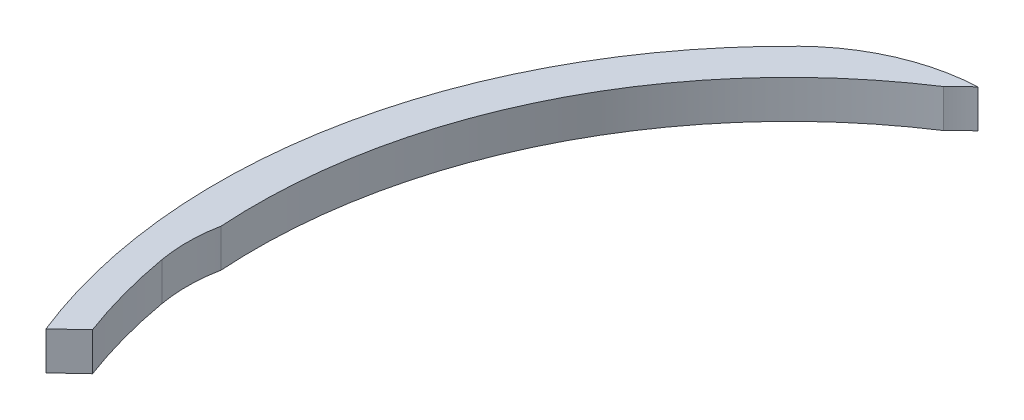
ISO-10303-21;
HEADER;
FILE_DESCRIPTION(('STEP AP214'),'2;1');
FILE_NAME('part.step','',(''),(''),'','','');
FILE_SCHEMA(('AUTOMOTIVE_DESIGN { 1 0 10303 214 1 1 1 1 }'));
ENDSEC;
DATA;
#1=APPLICATION_CONTEXT('core data for automotive mechanical design processes');
#2=APPLICATION_PROTOCOL_DEFINITION('international standard','automotive_design',2000,#1);
#3=PRODUCT_CONTEXT('',#1,'mechanical');
#4=PRODUCT('Part','Part','',(#3));
#5=PRODUCT_RELATED_PRODUCT_CATEGORY('part','',(#4));
#6=PRODUCT_DEFINITION_FORMATION('','',#4);
#7=PRODUCT_DEFINITION_CONTEXT('part definition',#1,'design');
#8=PRODUCT_DEFINITION('design','',#6,#7);
#9=PRODUCT_DEFINITION_SHAPE('','',#8);
#10=(LENGTH_UNIT() NAMED_UNIT(*) SI_UNIT(.MILLI.,.METRE.));
#11=(NAMED_UNIT(*) PLANE_ANGLE_UNIT() SI_UNIT($,.RADIAN.));
#12=(NAMED_UNIT(*) SI_UNIT($,.STERADIAN.) SOLID_ANGLE_UNIT());
#13=UNCERTAINTY_MEASURE_WITH_UNIT(LENGTH_MEASURE(1.E-05),#10,'distance_accuracy_value','');
#14=(GEOMETRIC_REPRESENTATION_CONTEXT(3) GLOBAL_UNCERTAINTY_ASSIGNED_CONTEXT((#13)) GLOBAL_UNIT_ASSIGNED_CONTEXT((#10,
#11,#12)) REPRESENTATION_CONTEXT('',''));
#15=CARTESIAN_POINT('',(0.,0.,0.));
#16=DIRECTION('',(0.,0.,1.));
#17=DIRECTION('',(1.,0.,0.));
#18=AXIS2_PLACEMENT_3D('',#15,#16,#17);
#19=CARTESIAN_POINT('',(-39.0305854804643,5.,-33.1147383686265));
#20=DIRECTION('',(0.,-1.,0.));
#21=DIRECTION('',(0.,0.,-1.));
#22=AXIS2_PLACEMENT_3D('',#19,#20,#21);
#23=CYLINDRICAL_SURFACE('',#22,21.);
#24=CARTESIAN_POINT('',(-39.0305854804643,0.,-33.1147383686265));
#25=DIRECTION('',(0.,1.,0.));
#26=DIRECTION('',(0.,0.,1.));
#27=AXIS2_PLACEMENT_3D('',#24,#25,#26);
#28=CIRCLE('',#27,21.);
#29=CARTESIAN_POINT('',(-52.3505116039844,0.,-49.3498721242802));
#30=VERTEX_POINT('',#29);
#31=CARTESIAN_POINT('',(-54.6669439070955,0.,-47.1327373397322));
#32=VERTEX_POINT('',#31);
#33=EDGE_CURVE('E122',#30,#32,#28,.T.);
#34=ORIENTED_EDGE('',*,*,#33,.F.);
#35=DIRECTION('',(0.,-1.,0.));
#36=VECTOR('',#35,1.);
#37=CARTESIAN_POINT('',(-52.3505116039844,5.,-49.3498721242802));
#38=LINE('',#37,#36);
#39=CARTESIAN_POINT('',(-52.3505116039844,5.,-49.3498721242802));
#40=VERTEX_POINT('',#39);
#41=EDGE_CURVE('E11',#40,#30,#38,.T.);
#42=ORIENTED_EDGE('',*,*,#41,.F.);
#43=CARTESIAN_POINT('',(-39.0305854804643,5.,-33.1147383686265));
#44=DIRECTION('',(0.,1.,0.));
#45=DIRECTION('',(0.,0.,1.));
#46=AXIS2_PLACEMENT_3D('',#43,#44,#45);
#47=CIRCLE('',#46,21.);
#48=CARTESIAN_POINT('',(-54.6669439070955,5.,-47.1327373397322));
#49=VERTEX_POINT('',#48);
#50=EDGE_CURVE('E137',#40,#49,#47,.T.);
#51=ORIENTED_EDGE('',*,*,#50,.T.);
#52=DIRECTION('',(0.,-1.,0.));
#53=VECTOR('',#52,1.);
#54=CARTESIAN_POINT('',(-54.6669439070955,5.,-47.1327373397322));
#55=LINE('',#54,#53);
#56=EDGE_CURVE('E51',#49,#32,#55,.T.);
#57=ORIENTED_EDGE('',*,*,#56,.T.);
#58=EDGE_LOOP('',(#34,#42,#51,#57));
#59=FACE_BOUND('',#58,.T.);
#60=ADVANCED_FACE('F35',(#59),#23,.F.);
#61=CARTESIAN_POINT('',(-51.2217062564328,5.,-24.3753691565067));
#62=DIRECTION('',(0.,-1.,0.));
#63=DIRECTION('',(0.,0.,-1.));
#64=AXIS2_PLACEMENT_3D('',#61,#62,#63);
#65=CYLINDRICAL_SURFACE('',#64,25.);
#66=CARTESIAN_POINT('',(-51.2217062564328,0.,-24.3753691565067));
#67=DIRECTION('',(0.,1.,0.));
#68=DIRECTION('',(0.,0.,1.));
#69=AXIS2_PLACEMENT_3D('',#66,#67,#68);
#70=CIRCLE('',#69,25.);
#71=CARTESIAN_POINT('',(-68.6703063832611,0.,-42.2791775115481));
#72=VERTEX_POINT('',#71);
#73=EDGE_CURVE('E124',#30,#72,#70,.T.);
#74=ORIENTED_EDGE('',*,*,#73,.T.);
#75=DIRECTION('',(0.,-1.,0.));
#76=VECTOR('',#75,1.);
#77=CARTESIAN_POINT('',(-68.6703063832611,5.,-42.2791775115481));
#78=LINE('',#77,#76);
#79=CARTESIAN_POINT('',(-68.6703063832611,5.,-42.2791775115481));
#80=VERTEX_POINT('',#79);
#81=EDGE_CURVE('E43',#80,#72,#78,.T.);
#82=ORIENTED_EDGE('',*,*,#81,.F.);
#83=CARTESIAN_POINT('',(-51.2217062564328,5.,-24.3753691565067));
#84=DIRECTION('',(0.,1.,0.));
#85=DIRECTION('',(0.,0.,1.));
#86=AXIS2_PLACEMENT_3D('',#83,#84,#85);
#87=CIRCLE('',#86,25.);
#88=EDGE_CURVE('E158',#40,#80,#87,.T.);
#89=ORIENTED_EDGE('',*,*,#88,.F.);
#90=ORIENTED_EDGE('',*,*,#41,.T.);
#91=EDGE_LOOP('',(#74,#82,#89,#90));
#92=FACE_BOUND('',#91,.T.);
#93=ADVANCED_FACE('F173',(#92),#65,.T.);
#94=CARTESIAN_POINT('',(-16.3245060027764,5.,11.4322475535761));
#95=DIRECTION('',(0.,-1.,0.));
#96=DIRECTION('',(0.,0.,-1.));
#97=AXIS2_PLACEMENT_3D('',#94,#95,#96);
#98=CYLINDRICAL_SURFACE('',#97,75.);
#99=CARTESIAN_POINT('',(-16.3245060027764,0.,11.4322475535761));
#100=DIRECTION('',(0.,1.,0.));
#101=DIRECTION('',(0.,0.,1.));
#102=AXIS2_PLACEMENT_3D('',#99,#100,#101);
#103=CIRCLE('',#102,75.);
#104=CARTESIAN_POINT('',(-85.9864773010488,0.,39.2209098970332));
#105=VERTEX_POINT('',#104);
#106=EDGE_CURVE('E126',#72,#105,#103,.T.);
#107=ORIENTED_EDGE('',*,*,#106,.T.);
#108=DIRECTION('',(0.,-1.,0.));
#109=VECTOR('',#108,1.);
#110=CARTESIAN_POINT('',(-85.9864773010488,5.,39.2209098970332));
#111=LINE('',#110,#109);
#112=CARTESIAN_POINT('',(-85.9864773010488,5.,39.2209098970332));
#113=VERTEX_POINT('',#112);
#114=EDGE_CURVE('E141',#113,#105,#111,.T.);
#115=ORIENTED_EDGE('',*,*,#114,.F.);
#116=CARTESIAN_POINT('',(-16.3245060027764,5.,11.4322475535761));
#117=DIRECTION('',(0.,1.,0.));
#118=DIRECTION('',(0.,0.,1.));
#119=AXIS2_PLACEMENT_3D('',#116,#117,#118);
#120=CIRCLE('',#119,75.);
#121=EDGE_CURVE('E150',#80,#113,#120,.T.);
#122=ORIENTED_EDGE('',*,*,#121,.F.);
#123=ORIENTED_EDGE('',*,*,#81,.T.);
#124=EDGE_LOOP('',(#107,#115,#122,#123));
#125=FACE_BOUND('',#124,.T.);
#126=ADVANCED_FACE('F148',(#125),#98,.T.);
#127=CARTESIAN_POINT('',(-20.5555363061315,5.,-21.9772599015827));
#128=DIRECTION('',(-0.683089146012106,0.,-0.730335004364745));
#129=DIRECTION('',(-0.730335004364745,0.,0.683089146012106));
#130=AXIS2_PLACEMENT_3D('',#127,#128,#129);
#131=PLANE('',#130);
#132=DIRECTION('',(0.730335004364745,0.,-0.683089146012106));
#133=VECTOR('',#132,1.);
#134=CARTESIAN_POINT('',(-20.5555363061315,0.,-21.9772599015827));
#135=LINE('',#134,#133);
#136=CARTESIAN_POINT('',(-82.8365383113827,0.,36.2747425606986));
#137=VERTEX_POINT('',#136);
#138=EDGE_CURVE('E128',#105,#137,#135,.T.);
#139=ORIENTED_EDGE('',*,*,#138,.T.);
#140=DIRECTION('',(0.,-1.,0.));
#141=VECTOR('',#140,1.);
#142=CARTESIAN_POINT('',(-82.8365383113827,5.,36.2747425606986));
#143=LINE('',#142,#141);
#144=CARTESIAN_POINT('',(-82.8365383113827,5.,36.2747425606986));
#145=VERTEX_POINT('',#144);
#146=EDGE_CURVE('E104',#145,#137,#143,.T.);
#147=ORIENTED_EDGE('',*,*,#146,.F.);
#148=DIRECTION('',(0.730335004364745,0.,-0.683089146012106));
#149=VECTOR('',#148,1.);
#150=CARTESIAN_POINT('',(-20.5555363061315,5.,-21.9772599015827));
#151=LINE('',#150,#149);
#152=EDGE_CURVE('E113',#113,#145,#151,.T.);
#153=ORIENTED_EDGE('',*,*,#152,.F.);
#154=ORIENTED_EDGE('',*,*,#114,.T.);
#155=EDGE_LOOP('',(#139,#147,#153,#154));
#156=FACE_BOUND('',#155,.T.);
#157=ADVANCED_FACE('F157',(#156),#131,.F.);
#158=CARTESIAN_POINT('',(-16.3245060027764,5.,11.4322475535761));
#159=DIRECTION('',(0.,-1.,0.));
#160=DIRECTION('',(0.,0.,-1.));
#161=AXIS2_PLACEMENT_3D('',#158,#159,#160);
#162=CYLINDRICAL_SURFACE('',#161,71.);
#163=CARTESIAN_POINT('',(-16.3245060027764,0.,11.4322475535761));
#164=DIRECTION('',(0.,1.,0.));
#165=DIRECTION('',(0.,0.,1.));
#166=AXIS2_PLACEMENT_3D('',#163,#164,#165);
#167=CIRCLE('',#166,71.);
#168=CARTESIAN_POINT('',(-86.2446190486046,0.,23.768283856157));
#169=VERTEX_POINT('',#168);
#170=EDGE_CURVE('E100',#169,#137,#167,.T.);
#171=ORIENTED_EDGE('',*,*,#170,.F.);
#172=DIRECTION('',(0.,-1.,0.));
#173=VECTOR('',#172,1.);
#174=CARTESIAN_POINT('',(-86.2446190486046,5.,23.768283856157));
#175=LINE('',#174,#173);
#176=CARTESIAN_POINT('',(-86.2446190486046,5.,23.768283856157));
#177=VERTEX_POINT('',#176);
#178=EDGE_CURVE('E95',#177,#169,#175,.T.);
#179=ORIENTED_EDGE('',*,*,#178,.F.);
#180=CARTESIAN_POINT('',(-16.3245060027764,5.,11.4322475535761));
#181=DIRECTION('',(0.,1.,0.));
#182=DIRECTION('',(0.,0.,1.));
#183=AXIS2_PLACEMENT_3D('',#180,#181,#182);
#184=CIRCLE('',#183,71.);
#185=EDGE_CURVE('E98',#177,#145,#184,.T.);
#186=ORIENTED_EDGE('',*,*,#185,.T.);
#187=ORIENTED_EDGE('',*,*,#146,.T.);
#188=EDGE_LOOP('',(#171,#179,#186,#187));
#189=FACE_BOUND('',#188,.T.);
#190=ADVANCED_FACE('F97',(#189),#162,.F.);
#191=CARTESIAN_POINT('',(-65.5640222322329,5.,20.1195970624359));
#192=DIRECTION('',(0.,-1.,0.));
#193=DIRECTION('',(0.,0.,-1.));
#194=AXIS2_PLACEMENT_3D('',#191,#192,#193);
#195=CYLINDRICAL_SURFACE('',#194,21.);
#196=CARTESIAN_POINT('',(-65.5640222322329,0.,20.1195970624359));
#197=DIRECTION('',(0.,1.,0.));
#198=DIRECTION('',(0.,0.,1.));
#199=AXIS2_PLACEMENT_3D('',#196,#197,#198);
#200=CIRCLE('',#199,21.);
#201=CARTESIAN_POINT('',(-86.1704913899171,0.,16.0731876845541));
#202=VERTEX_POINT('',#201);
#203=EDGE_CURVE('E132',#202,#169,#200,.T.);
#204=ORIENTED_EDGE('',*,*,#203,.F.);
#205=DIRECTION('',(0.,-1.,0.));
#206=VECTOR('',#205,1.);
#207=CARTESIAN_POINT('',(-86.1704913899171,5.,16.0731876845541));
#208=LINE('',#207,#206);
#209=CARTESIAN_POINT('',(-86.1704913899171,5.,16.0731876845541));
#210=VERTEX_POINT('',#209);
#211=EDGE_CURVE('E73',#210,#202,#208,.T.);
#212=ORIENTED_EDGE('',*,*,#211,.F.);
#213=CARTESIAN_POINT('',(-65.5640222322329,5.,20.1195970624359));
#214=DIRECTION('',(0.,1.,0.));
#215=DIRECTION('',(0.,0.,1.));
#216=AXIS2_PLACEMENT_3D('',#213,#214,#215);
#217=CIRCLE('',#216,21.);
#218=EDGE_CURVE('E111',#210,#177,#217,.T.);
#219=ORIENTED_EDGE('',*,*,#218,.T.);
#220=ORIENTED_EDGE('',*,*,#178,.T.);
#221=EDGE_LOOP('',(#204,#212,#219,#220));
#222=FACE_BOUND('',#221,.T.);
#223=ADVANCED_FACE('F116',(#222),#195,.F.);
#224=CARTESIAN_POINT('',(-16.3245060027764,5.,11.4322475535761));
#225=DIRECTION('',(0.,-1.,0.));
#226=DIRECTION('',(0.,0.,-1.));
#227=AXIS2_PLACEMENT_3D('',#224,#225,#226);
#228=CYLINDRICAL_SURFACE('',#227,70.);
#229=CARTESIAN_POINT('',(-16.3245060027764,0.,11.4322475535761));
#230=DIRECTION('',(0.,1.,0.));
#231=DIRECTION('',(0.,0.,1.));
#232=AXIS2_PLACEMENT_3D('',#229,#230,#231);
#233=CIRCLE('',#232,70.);
#234=EDGE_CURVE('E134',#32,#202,#233,.T.);
#235=ORIENTED_EDGE('',*,*,#234,.F.);
#236=ORIENTED_EDGE('',*,*,#56,.F.);
#237=CARTESIAN_POINT('',(-16.3245060027764,5.,11.4322475535761));
#238=DIRECTION('',(0.,1.,0.));
#239=DIRECTION('',(0.,0.,1.));
#240=AXIS2_PLACEMENT_3D('',#237,#238,#239);
#241=CIRCLE('',#240,70.);
#242=EDGE_CURVE('E117',#49,#210,#241,.T.);
#243=ORIENTED_EDGE('',*,*,#242,.T.);
#244=ORIENTED_EDGE('',*,*,#211,.T.);
#245=EDGE_LOOP('',(#235,#236,#243,#244));
#246=FACE_BOUND('',#245,.T.);
#247=ADVANCED_FACE('F162',(#246),#228,.F.);
#248=CARTESIAN_POINT('',(0.,5.,0.));
#249=DIRECTION('',(0.,1.,0.));
#250=DIRECTION('',(0.,0.,1.));
#251=AXIS2_PLACEMENT_3D('',#248,#249,#250);
#252=PLANE('',#251);
#253=ORIENTED_EDGE('',*,*,#50,.F.);
#254=ORIENTED_EDGE('',*,*,#88,.T.);
#255=ORIENTED_EDGE('',*,*,#121,.T.);
#256=ORIENTED_EDGE('',*,*,#152,.T.);
#257=ORIENTED_EDGE('',*,*,#185,.F.);
#258=ORIENTED_EDGE('',*,*,#218,.F.);
#259=ORIENTED_EDGE('',*,*,#242,.F.);
#260=EDGE_LOOP('',(#253,#254,#255,#256,#257,#258,#259));
#261=FACE_BOUND('',#260,.T.);
#262=ADVANCED_FACE('F109',(#261),#252,.T.);
#263=CARTESIAN_POINT('',(0.,0.,0.));
#264=DIRECTION('',(0.,1.,0.));
#265=DIRECTION('',(0.,0.,1.));
#266=AXIS2_PLACEMENT_3D('',#263,#264,#265);
#267=PLANE('',#266);
#268=ORIENTED_EDGE('',*,*,#33,.T.);
#269=ORIENTED_EDGE('',*,*,#234,.T.);
#270=ORIENTED_EDGE('',*,*,#203,.T.);
#271=ORIENTED_EDGE('',*,*,#170,.T.);
#272=ORIENTED_EDGE('',*,*,#138,.F.);
#273=ORIENTED_EDGE('',*,*,#106,.F.);
#274=ORIENTED_EDGE('',*,*,#73,.F.);
#275=EDGE_LOOP('',(#268,#269,#270,#271,#272,#273,#274));
#276=FACE_BOUND('',#275,.T.);
#277=ADVANCED_FACE('F155',(#276),#267,.F.);
#278=CLOSED_SHELL('',(#60,#93,#126,#157,#190,#223,#247,#262,#277));
#279=MANIFOLD_SOLID_BREP('B2',#278);
#280=ADVANCED_BREP_SHAPE_REPRESENTATION('',(#18,#279),#14);
#281=SHAPE_DEFINITION_REPRESENTATION(#9,#280);
ENDSEC;
END-ISO-10303-21;
